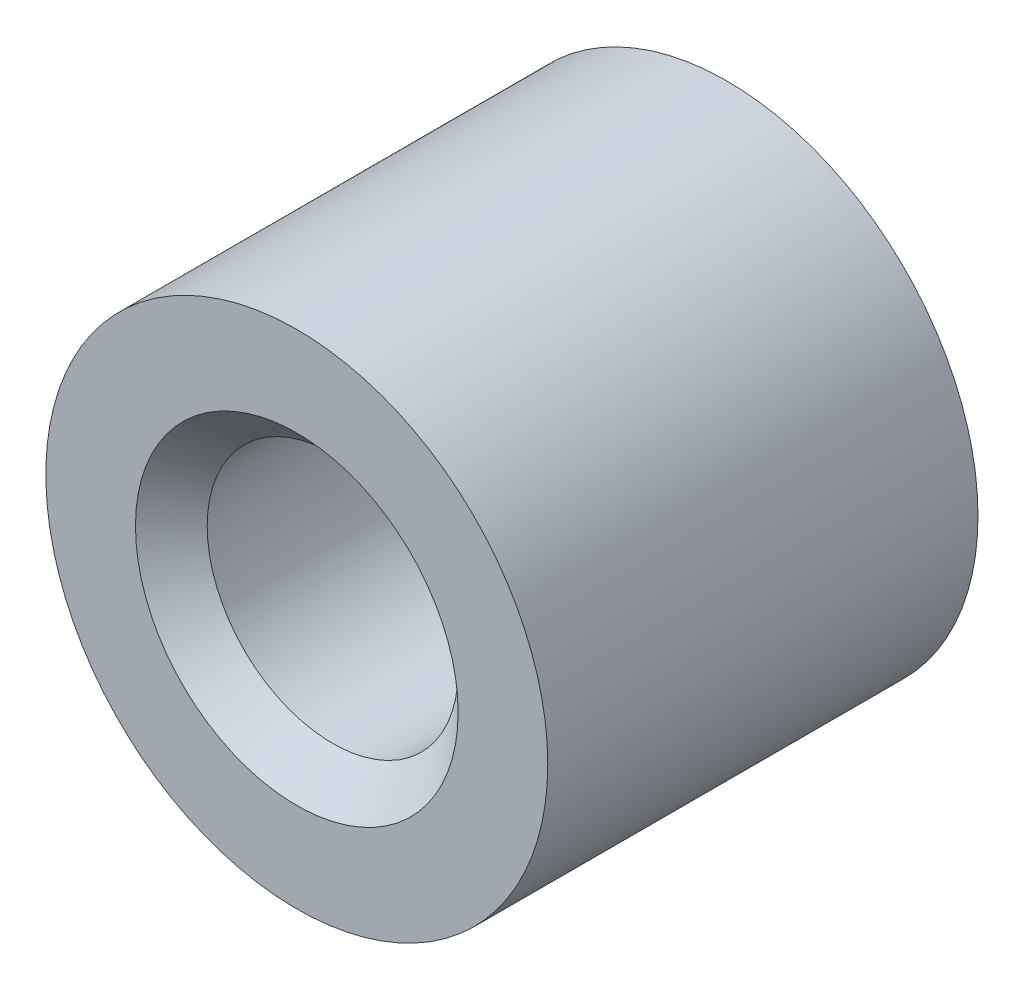
ISO-10303-21;
HEADER;
FILE_DESCRIPTION(('STEP AP214'),'2;1');
FILE_NAME('part.step','',(''),(''),'','','');
FILE_SCHEMA(('AUTOMOTIVE_DESIGN { 1 0 10303 214 1 1 1 1 }'));
ENDSEC;
DATA;
#1=APPLICATION_CONTEXT('core data for automotive mechanical design processes');
#2=APPLICATION_PROTOCOL_DEFINITION('international standard','automotive_design',2000,#1);
#3=PRODUCT_CONTEXT('',#1,'mechanical');
#4=PRODUCT('Part','Part','',(#3));
#5=PRODUCT_RELATED_PRODUCT_CATEGORY('part','',(#4));
#6=PRODUCT_DEFINITION_FORMATION('','',#4);
#7=PRODUCT_DEFINITION_CONTEXT('part definition',#1,'design');
#8=PRODUCT_DEFINITION('design','',#6,#7);
#9=PRODUCT_DEFINITION_SHAPE('','',#8);
#10=(LENGTH_UNIT() NAMED_UNIT(*) SI_UNIT(.MILLI.,.METRE.));
#11=(NAMED_UNIT(*) PLANE_ANGLE_UNIT() SI_UNIT($,.RADIAN.));
#12=(NAMED_UNIT(*) SI_UNIT($,.STERADIAN.) SOLID_ANGLE_UNIT());
#13=UNCERTAINTY_MEASURE_WITH_UNIT(LENGTH_MEASURE(1.E-05),#10,'distance_accuracy_value','');
#14=(GEOMETRIC_REPRESENTATION_CONTEXT(3) GLOBAL_UNCERTAINTY_ASSIGNED_CONTEXT((#13)) GLOBAL_UNIT_ASSIGNED_CONTEXT((#10,
#11,#12)) REPRESENTATION_CONTEXT('',''));
#15=CARTESIAN_POINT('',(0.,0.,0.));
#16=DIRECTION('',(0.,0.,1.));
#17=DIRECTION('',(1.,0.,0.));
#18=AXIS2_PLACEMENT_3D('',#15,#16,#17);
#19=CARTESIAN_POINT('',(0.,0.,6.));
#20=DIRECTION('',(0.,0.,-1.));
#21=DIRECTION('',(-1.,0.,0.));
#22=AXIS2_PLACEMENT_3D('',#19,#20,#21);
#23=CYLINDRICAL_SURFACE('',#22,3.5);
#24=CARTESIAN_POINT('',(0.,0.,6.));
#25=DIRECTION('',(0.,0.,1.));
#26=DIRECTION('',(1.,0.,0.));
#27=AXIS2_PLACEMENT_3D('',#24,#25,#26);
#28=CIRCLE('',#27,3.5);
#29=CARTESIAN_POINT('',(3.5,0.,6.));
#30=VERTEX_POINT('',#29);
#31=EDGE_CURVE('E44',#30,#30,#28,.T.);
#32=ORIENTED_EDGE('',*,*,#31,.F.);
#33=EDGE_LOOP('',(#32));
#34=FACE_BOUND('',#33,.T.);
#35=CARTESIAN_POINT('',(0.,0.,0.));
#36=DIRECTION('',(0.,0.,1.));
#37=DIRECTION('',(1.,0.,0.));
#38=AXIS2_PLACEMENT_3D('',#35,#36,#37);
#39=CIRCLE('',#38,3.5);
#40=CARTESIAN_POINT('',(3.5,0.,0.));
#41=VERTEX_POINT('',#40);
#42=EDGE_CURVE('E48',#41,#41,#39,.T.);
#43=ORIENTED_EDGE('',*,*,#42,.T.);
#44=EDGE_LOOP('',(#43));
#45=FACE_BOUND('',#44,.T.);
#46=ADVANCED_FACE('F33',(#34,#45),#23,.T.);
#47=CARTESIAN_POINT('',(0.,0.,6.));
#48=DIRECTION('',(0.,0.,1.));
#49=DIRECTION('',(1.,0.,0.));
#50=AXIS2_PLACEMENT_3D('',#47,#48,#49);
#51=PLANE('',#50);
#52=CARTESIAN_POINT('',(0.,0.,6.));
#53=DIRECTION('',(0.,0.,1.));
#54=DIRECTION('',(1.,0.,0.));
#55=AXIS2_PLACEMENT_3D('',#52,#53,#54);
#56=CIRCLE('',#55,2.25);
#57=CARTESIAN_POINT('',(2.25,0.,6.));
#58=VERTEX_POINT('',#57);
#59=EDGE_CURVE('E10',#58,#58,#56,.F.);
#60=ORIENTED_EDGE('',*,*,#59,.T.);
#61=EDGE_LOOP('',(#60));
#62=FACE_BOUND('',#61,.T.);
#63=ORIENTED_EDGE('',*,*,#31,.T.);
#64=EDGE_LOOP('',(#63));
#65=FACE_BOUND('',#64,.T.);
#66=ADVANCED_FACE('F68',(#62,#65),#51,.T.);
#67=CARTESIAN_POINT('',(0.,0.,0.));
#68=DIRECTION('',(0.,0.,1.));
#69=DIRECTION('',(1.,0.,0.));
#70=AXIS2_PLACEMENT_3D('',#67,#68,#69);
#71=PLANE('',#70);
#72=CARTESIAN_POINT('',(0.,0.,0.));
#73=DIRECTION('',(0.,0.,1.));
#74=DIRECTION('',(1.,0.,0.));
#75=AXIS2_PLACEMENT_3D('',#72,#73,#74);
#76=CIRCLE('',#75,1.75);
#77=CARTESIAN_POINT('',(1.75,0.,0.));
#78=VERTEX_POINT('',#77);
#79=EDGE_CURVE('E52',#78,#78,#76,.T.);
#80=ORIENTED_EDGE('',*,*,#79,.T.);
#81=EDGE_LOOP('',(#80));
#82=FACE_BOUND('',#81,.T.);
#83=ORIENTED_EDGE('',*,*,#42,.F.);
#84=EDGE_LOOP('',(#83));
#85=FACE_BOUND('',#84,.T.);
#86=ADVANCED_FACE('F57',(#82,#85),#71,.F.);
#87=CARTESIAN_POINT('',(0.,0.,0.));
#88=DIRECTION('',(0.,0.,1.));
#89=DIRECTION('',(1.,0.,0.));
#90=AXIS2_PLACEMENT_3D('',#87,#88,#89);
#91=CYLINDRICAL_SURFACE('',#90,1.75);
#92=CARTESIAN_POINT('',(0.,0.,5.5));
#93=DIRECTION('',(0.,0.,1.));
#94=DIRECTION('',(1.,0.,0.));
#95=AXIS2_PLACEMENT_3D('',#92,#93,#94);
#96=CIRCLE('',#95,1.75);
#97=CARTESIAN_POINT('',(1.75,0.,5.5));
#98=VERTEX_POINT('',#97);
#99=EDGE_CURVE('E40',#98,#98,#96,.T.);
#100=ORIENTED_EDGE('',*,*,#99,.T.);
#101=EDGE_LOOP('',(#100));
#102=FACE_BOUND('',#101,.T.);
#103=ORIENTED_EDGE('',*,*,#79,.F.);
#104=EDGE_LOOP('',(#103));
#105=FACE_BOUND('',#104,.T.);
#106=ADVANCED_FACE('F60',(#102,#105),#91,.F.);
#107=CARTESIAN_POINT('',(0.,0.,5.5));
#108=DIRECTION('',(0.,0.,1.));
#109=DIRECTION('',(1.,0.,0.));
#110=AXIS2_PLACEMENT_3D('',#107,#108,#109);
#111=CONICAL_SURFACE('',#110,1.75,0.785398163397449);
#112=ORIENTED_EDGE('',*,*,#59,.F.);
#113=EDGE_LOOP('',(#112));
#114=FACE_BOUND('',#113,.T.);
#115=ORIENTED_EDGE('',*,*,#99,.F.);
#116=EDGE_LOOP('',(#115));
#117=FACE_BOUND('',#116,.T.);
#118=ADVANCED_FACE('F35',(#114,#117),#111,.F.);
#119=CLOSED_SHELL('',(#46,#66,#86,#106,#118));
#120=MANIFOLD_SOLID_BREP('B2',#119);
#121=ADVANCED_BREP_SHAPE_REPRESENTATION('',(#18,#120),#14);
#122=SHAPE_DEFINITION_REPRESENTATION(#9,#121);
ENDSEC;
END-ISO-10303-21;
